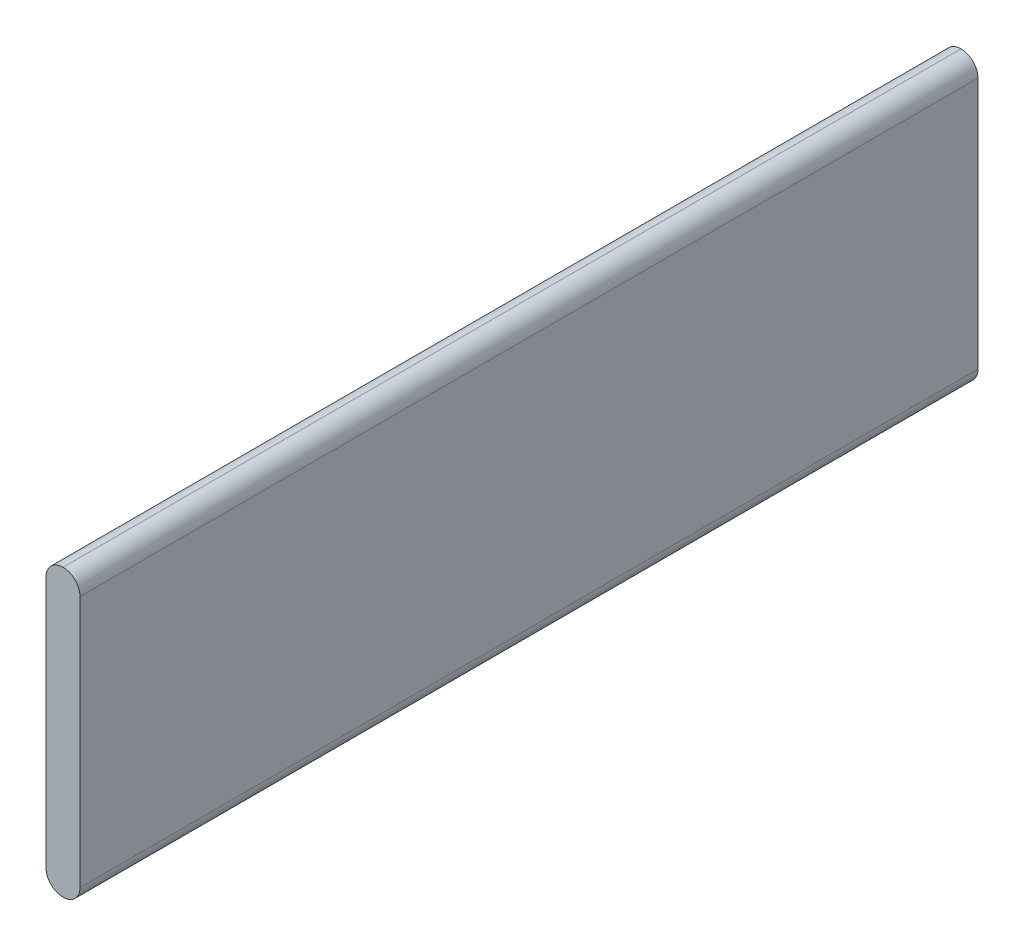
ISO-10303-21;
HEADER;
FILE_DESCRIPTION(('STEP AP214'),'2;1');
FILE_NAME('part.step','',(''),(''),'','','');
FILE_SCHEMA(('AUTOMOTIVE_DESIGN { 1 0 10303 214 1 1 1 1 }'));
ENDSEC;
DATA;
#1=APPLICATION_CONTEXT('core data for automotive mechanical design processes');
#2=APPLICATION_PROTOCOL_DEFINITION('international standard','automotive_design',2000,#1);
#3=PRODUCT_CONTEXT('',#1,'mechanical');
#4=PRODUCT('Part','Part','',(#3));
#5=PRODUCT_RELATED_PRODUCT_CATEGORY('part','',(#4));
#6=PRODUCT_DEFINITION_FORMATION('','',#4);
#7=PRODUCT_DEFINITION_CONTEXT('part definition',#1,'design');
#8=PRODUCT_DEFINITION('design','',#6,#7);
#9=PRODUCT_DEFINITION_SHAPE('','',#8);
#10=(LENGTH_UNIT() NAMED_UNIT(*) SI_UNIT(.MILLI.,.METRE.));
#11=(NAMED_UNIT(*) PLANE_ANGLE_UNIT() SI_UNIT($,.RADIAN.));
#12=(NAMED_UNIT(*) SI_UNIT($,.STERADIAN.) SOLID_ANGLE_UNIT());
#13=UNCERTAINTY_MEASURE_WITH_UNIT(LENGTH_MEASURE(1.E-05),#10,'distance_accuracy_value','');
#14=(GEOMETRIC_REPRESENTATION_CONTEXT(3) GLOBAL_UNCERTAINTY_ASSIGNED_CONTEXT((#13)) GLOBAL_UNIT_ASSIGNED_CONTEXT((#10,
#11,#12)) REPRESENTATION_CONTEXT('',''));
#15=CARTESIAN_POINT('',(0.,0.,0.));
#16=DIRECTION('',(0.,0.,1.));
#17=DIRECTION('',(1.,0.,0.));
#18=AXIS2_PLACEMENT_3D('',#15,#16,#17);
#19=CARTESIAN_POINT('',(-9.96167473590151,17.676969353008,65.9999999999999));
#20=DIRECTION('',(0.,0.,-1.));
#21=DIRECTION('',(-1.,0.,0.));
#22=AXIS2_PLACEMENT_3D('',#19,#20,#21);
#23=CYLINDRICAL_SURFACE('',#22,1.24);
#24=CARTESIAN_POINT('',(-9.96167473590151,17.6769693530079,0.));
#25=DIRECTION('',(0.,0.,1.));
#26=DIRECTION('',(-1.,0.,0.));
#27=AXIS2_PLACEMENT_3D('',#24,#25,#26);
#28=CIRCLE('',#27,1.24);
#29=CARTESIAN_POINT('',(-8.72167473590151,17.6769693530079,0.));
#30=VERTEX_POINT('',#29);
#31=CARTESIAN_POINT('',(-9.96167473590152,18.9169693530079,0.));
#32=VERTEX_POINT('',#31);
#33=EDGE_CURVE('E130',#30,#32,#28,.T.);
#34=ORIENTED_EDGE('',*,*,#33,.T.);
#35=DIRECTION('',(0.,0.,-1.));
#36=VECTOR('',#35,1.);
#37=CARTESIAN_POINT('',(-9.96167473590152,18.9169693530079,65.9999999999999));
#38=LINE('',#37,#36);
#39=CARTESIAN_POINT('',(-9.96167473590152,18.9169693530079,65.9999999999999));
#40=VERTEX_POINT('',#39);
#41=EDGE_CURVE('E11',#40,#32,#38,.T.);
#42=ORIENTED_EDGE('',*,*,#41,.F.);
#43=CARTESIAN_POINT('',(-9.96167473590151,17.676969353008,65.9999999999999));
#44=DIRECTION('',(0.,0.,1.));
#45=DIRECTION('',(-1.,0.,0.));
#46=AXIS2_PLACEMENT_3D('',#43,#44,#45);
#47=CIRCLE('',#46,1.24);
#48=CARTESIAN_POINT('',(-8.72167473590151,17.676969353008,66.));
#49=VERTEX_POINT('',#48);
#50=EDGE_CURVE('E144',#49,#40,#47,.T.);
#51=ORIENTED_EDGE('',*,*,#50,.F.);
#52=DIRECTION('',(0.,0.,-1.));
#53=VECTOR('',#52,1.);
#54=CARTESIAN_POINT('',(-8.72167473590151,17.676969353008,66.));
#55=LINE('',#54,#53);
#56=EDGE_CURVE('E126',#49,#30,#55,.T.);
#57=ORIENTED_EDGE('',*,*,#56,.T.);
#58=EDGE_LOOP('',(#34,#42,#51,#57));
#59=FACE_BOUND('',#58,.T.);
#60=ADVANCED_FACE('F34',(#59),#23,.T.);
#61=CARTESIAN_POINT('',(-9.9816747359015,18.9169693530079,65.9999999999999));
#62=DIRECTION('',(0.,-1.,0.));
#63=DIRECTION('',(0.,0.,-1.));
#64=AXIS2_PLACEMENT_3D('',#61,#62,#63);
#65=PLANE('',#64);
#66=DIRECTION('',(-1.,0.,0.));
#67=VECTOR('',#66,1.);
#68=CARTESIAN_POINT('',(-9.9816747359015,18.9169693530079,0.));
#69=LINE('',#68,#67);
#70=CARTESIAN_POINT('',(-9.9816747359015,18.9169693530079,0.));
#71=VERTEX_POINT('',#70);
#72=EDGE_CURVE('E133',#32,#71,#69,.T.);
#73=ORIENTED_EDGE('',*,*,#72,.T.);
#74=DIRECTION('',(0.,0.,-1.));
#75=VECTOR('',#74,1.);
#76=CARTESIAN_POINT('',(-9.9816747359015,18.9169693530079,65.9999999999999));
#77=LINE('',#76,#75);
#78=CARTESIAN_POINT('',(-9.9816747359015,18.9169693530079,65.9999999999999));
#79=VERTEX_POINT('',#78);
#80=EDGE_CURVE('E42',#79,#71,#77,.T.);
#81=ORIENTED_EDGE('',*,*,#80,.F.);
#82=DIRECTION('',(-1.,0.,0.));
#83=VECTOR('',#82,1.);
#84=CARTESIAN_POINT('',(-9.9816747359015,18.9169693530079,65.9999999999999));
#85=LINE('',#84,#83);
#86=EDGE_CURVE('E93',#40,#79,#85,.T.);
#87=ORIENTED_EDGE('',*,*,#86,.F.);
#88=ORIENTED_EDGE('',*,*,#41,.T.);
#89=EDGE_LOOP('',(#73,#81,#87,#88));
#90=FACE_BOUND('',#89,.T.);
#91=ADVANCED_FACE('F179',(#90),#65,.F.);
#92=CARTESIAN_POINT('',(-9.98167473590151,17.676969353008,65.9999999999999));
#93=DIRECTION('',(0.,0.,-1.));
#94=DIRECTION('',(-1.,0.,0.));
#95=AXIS2_PLACEMENT_3D('',#92,#93,#94);
#96=CYLINDRICAL_SURFACE('',#95,1.24);
#97=CARTESIAN_POINT('',(-9.98167473590151,17.6769693530079,0.));
#98=DIRECTION('',(0.,0.,1.));
#99=DIRECTION('',(-1.,0.,0.));
#100=AXIS2_PLACEMENT_3D('',#97,#98,#99);
#101=CIRCLE('',#100,1.24);
#102=CARTESIAN_POINT('',(-11.2216747359015,17.6769693530079,0.));
#103=VERTEX_POINT('',#102);
#104=EDGE_CURVE('E135',#71,#103,#101,.T.);
#105=ORIENTED_EDGE('',*,*,#104,.T.);
#106=DIRECTION('',(0.,0.,-1.));
#107=VECTOR('',#106,1.);
#108=CARTESIAN_POINT('',(-11.2216747359015,17.676969353008,66.));
#109=LINE('',#108,#107);
#110=CARTESIAN_POINT('',(-11.2216747359015,17.676969353008,66.));
#111=VERTEX_POINT('',#110);
#112=EDGE_CURVE('E151',#111,#103,#109,.T.);
#113=ORIENTED_EDGE('',*,*,#112,.F.);
#114=CARTESIAN_POINT('',(-9.98167473590151,17.676969353008,65.9999999999999));
#115=DIRECTION('',(0.,0.,1.));
#116=DIRECTION('',(-1.,0.,0.));
#117=AXIS2_PLACEMENT_3D('',#114,#115,#116);
#118=CIRCLE('',#117,1.24);
#119=EDGE_CURVE('E159',#79,#111,#118,.T.);
#120=ORIENTED_EDGE('',*,*,#119,.F.);
#121=ORIENTED_EDGE('',*,*,#80,.T.);
#122=EDGE_LOOP('',(#105,#113,#120,#121));
#123=FACE_BOUND('',#122,.T.);
#124=ADVANCED_FACE('F157',(#123),#96,.T.);
#125=CARTESIAN_POINT('',(-11.2216747359015,17.676969353008,66.));
#126=DIRECTION('',(1.,0.,0.));
#127=DIRECTION('',(0.,1.,0.));
#128=AXIS2_PLACEMENT_3D('',#125,#126,#127);
#129=PLANE('',#128);
#130=DIRECTION('',(0.,-1.,0.));
#131=VECTOR('',#130,1.);
#132=CARTESIAN_POINT('',(-11.2216747359015,17.6769693530079,0.));
#133=LINE('',#132,#131);
#134=CARTESIAN_POINT('',(-11.2216747359015,-0.843030646992045,0.));
#135=VERTEX_POINT('',#134);
#136=EDGE_CURVE('E137',#103,#135,#133,.T.);
#137=ORIENTED_EDGE('',*,*,#136,.T.);
#138=DIRECTION('',(0.,0.,-1.));
#139=VECTOR('',#138,1.);
#140=CARTESIAN_POINT('',(-11.2216747359015,-0.843030646992066,66.));
#141=LINE('',#140,#139);
#142=CARTESIAN_POINT('',(-11.2216747359015,-0.843030646992066,66.));
#143=VERTEX_POINT('',#142);
#144=EDGE_CURVE('E148',#143,#135,#141,.T.);
#145=ORIENTED_EDGE('',*,*,#144,.F.);
#146=DIRECTION('',(0.,-1.,0.));
#147=VECTOR('',#146,1.);
#148=CARTESIAN_POINT('',(-11.2216747359015,17.676969353008,66.));
#149=LINE('',#148,#147);
#150=EDGE_CURVE('E171',#111,#143,#149,.T.);
#151=ORIENTED_EDGE('',*,*,#150,.F.);
#152=ORIENTED_EDGE('',*,*,#112,.T.);
#153=EDGE_LOOP('',(#137,#145,#151,#152));
#154=FACE_BOUND('',#153,.T.);
#155=ADVANCED_FACE('F167',(#154),#129,.F.);
#156=CARTESIAN_POINT('',(-9.98167473590151,-0.843030646992073,66.));
#157=DIRECTION('',(0.,0.,-1.));
#158=DIRECTION('',(-1.,0.,0.));
#159=AXIS2_PLACEMENT_3D('',#156,#157,#158);
#160=CYLINDRICAL_SURFACE('',#159,1.24);
#161=CARTESIAN_POINT('',(-9.98167473590151,-0.843030646992059,0.));
#162=DIRECTION('',(0.,0.,1.));
#163=DIRECTION('',(1.,0.,0.));
#164=AXIS2_PLACEMENT_3D('',#161,#162,#163);
#165=CIRCLE('',#164,1.24);
#166=CARTESIAN_POINT('',(-9.9816747359015,-2.08303064699206,0.));
#167=VERTEX_POINT('',#166);
#168=EDGE_CURVE('E139',#135,#167,#165,.T.);
#169=ORIENTED_EDGE('',*,*,#168,.T.);
#170=DIRECTION('',(0.,0.,-1.));
#171=VECTOR('',#170,1.);
#172=CARTESIAN_POINT('',(-9.9816747359015,-2.08303064699208,66.));
#173=LINE('',#172,#171);
#174=CARTESIAN_POINT('',(-9.9816747359015,-2.08303064699208,66.));
#175=VERTEX_POINT('',#174);
#176=EDGE_CURVE('E121',#175,#167,#173,.T.);
#177=ORIENTED_EDGE('',*,*,#176,.F.);
#178=CARTESIAN_POINT('',(-9.98167473590151,-0.843030646992073,66.));
#179=DIRECTION('',(0.,0.,1.));
#180=DIRECTION('',(1.,0.,0.));
#181=AXIS2_PLACEMENT_3D('',#178,#179,#180);
#182=CIRCLE('',#181,1.24);
#183=EDGE_CURVE('E112',#143,#175,#182,.T.);
#184=ORIENTED_EDGE('',*,*,#183,.F.);
#185=ORIENTED_EDGE('',*,*,#144,.T.);
#186=EDGE_LOOP('',(#169,#177,#184,#185));
#187=FACE_BOUND('',#186,.T.);
#188=ADVANCED_FACE('F170',(#187),#160,.T.);
#189=CARTESIAN_POINT('',(-9.9816747359015,-2.08303064699208,66.));
#190=DIRECTION('',(0.,1.,0.));
#191=DIRECTION('',(0.,0.,1.));
#192=AXIS2_PLACEMENT_3D('',#189,#190,#191);
#193=PLANE('',#192);
#194=DIRECTION('',(1.,0.,0.));
#195=VECTOR('',#194,1.);
#196=CARTESIAN_POINT('',(-9.9816747359015,-2.08303064699206,0.));
#197=LINE('',#196,#195);
#198=CARTESIAN_POINT('',(-9.96167473590152,-2.08303064699206,0.));
#199=VERTEX_POINT('',#198);
#200=EDGE_CURVE('E120',#167,#199,#197,.T.);
#201=ORIENTED_EDGE('',*,*,#200,.T.);
#202=DIRECTION('',(0.,0.,-1.));
#203=VECTOR('',#202,1.);
#204=CARTESIAN_POINT('',(-9.96167473590152,-2.08303064699208,66.));
#205=LINE('',#204,#203);
#206=CARTESIAN_POINT('',(-9.96167473590152,-2.08303064699208,66.));
#207=VERTEX_POINT('',#206);
#208=EDGE_CURVE('E117',#207,#199,#205,.T.);
#209=ORIENTED_EDGE('',*,*,#208,.F.);
#210=DIRECTION('',(1.,0.,0.));
#211=VECTOR('',#210,1.);
#212=CARTESIAN_POINT('',(-9.9816747359015,-2.08303064699208,66.));
#213=LINE('',#212,#211);
#214=EDGE_CURVE('E106',#175,#207,#213,.T.);
#215=ORIENTED_EDGE('',*,*,#214,.F.);
#216=ORIENTED_EDGE('',*,*,#176,.T.);
#217=EDGE_LOOP('',(#201,#209,#215,#216));
#218=FACE_BOUND('',#217,.T.);
#219=ADVANCED_FACE('F118',(#218),#193,.F.);
#220=CARTESIAN_POINT('',(-9.96167473590151,-0.843030646992073,66.));
#221=DIRECTION('',(0.,0.,-1.));
#222=DIRECTION('',(-1.,0.,0.));
#223=AXIS2_PLACEMENT_3D('',#220,#221,#222);
#224=CYLINDRICAL_SURFACE('',#223,1.24);
#225=CARTESIAN_POINT('',(-9.96167473590151,-0.843030646992059,0.));
#226=DIRECTION('',(0.,0.,1.));
#227=DIRECTION('',(-1.,0.,0.));
#228=AXIS2_PLACEMENT_3D('',#225,#226,#227);
#229=CIRCLE('',#228,1.24);
#230=CARTESIAN_POINT('',(-8.7216747359015,-0.843030646992045,0.));
#231=VERTEX_POINT('',#230);
#232=EDGE_CURVE('E79',#199,#231,#229,.T.);
#233=ORIENTED_EDGE('',*,*,#232,.T.);
#234=DIRECTION('',(0.,0.,-1.));
#235=VECTOR('',#234,1.);
#236=CARTESIAN_POINT('',(-8.72167473590151,-0.843030646992066,65.9999999999999));
#237=LINE('',#236,#235);
#238=CARTESIAN_POINT('',(-8.72167473590151,-0.843030646992066,65.9999999999999));
#239=VERTEX_POINT('',#238);
#240=EDGE_CURVE('E122',#239,#231,#237,.T.);
#241=ORIENTED_EDGE('',*,*,#240,.F.);
#242=CARTESIAN_POINT('',(-9.96167473590151,-0.843030646992073,66.));
#243=DIRECTION('',(0.,0.,1.));
#244=DIRECTION('',(-1.,0.,0.));
#245=AXIS2_PLACEMENT_3D('',#242,#243,#244);
#246=CIRCLE('',#245,1.24);
#247=EDGE_CURVE('E110',#207,#239,#246,.T.);
#248=ORIENTED_EDGE('',*,*,#247,.F.);
#249=ORIENTED_EDGE('',*,*,#208,.T.);
#250=EDGE_LOOP('',(#233,#241,#248,#249));
#251=FACE_BOUND('',#250,.T.);
#252=ADVANCED_FACE('F124',(#251),#224,.T.);
#253=CARTESIAN_POINT('',(-8.72167473590151,17.676969353008,66.));
#254=DIRECTION('',(-1.,0.,0.));
#255=DIRECTION('',(0.,0.,1.));
#256=AXIS2_PLACEMENT_3D('',#253,#254,#255);
#257=PLANE('',#256);
#258=DIRECTION('',(0.,1.,0.));
#259=VECTOR('',#258,1.);
#260=CARTESIAN_POINT('',(-8.72167473590151,17.6769693530079,0.));
#261=LINE('',#260,#259);
#262=EDGE_CURVE('E85',#231,#30,#261,.T.);
#263=ORIENTED_EDGE('',*,*,#262,.T.);
#264=ORIENTED_EDGE('',*,*,#56,.F.);
#265=DIRECTION('',(0.,1.,0.));
#266=VECTOR('',#265,1.);
#267=CARTESIAN_POINT('',(-8.72167473590151,17.676969353008,66.));
#268=LINE('',#267,#266);
#269=EDGE_CURVE('E50',#239,#49,#268,.T.);
#270=ORIENTED_EDGE('',*,*,#269,.F.);
#271=ORIENTED_EDGE('',*,*,#240,.T.);
#272=EDGE_LOOP('',(#263,#264,#270,#271));
#273=FACE_BOUND('',#272,.T.);
#274=ADVANCED_FACE('F195',(#273),#257,.F.);
#275=CARTESIAN_POINT('',(-9.96167473590151,17.676969353008,65.9999999999999));
#276=DIRECTION('',(0.,0.,-1.));
#277=DIRECTION('',(-1.,0.,0.));
#278=AXIS2_PLACEMENT_3D('',#275,#276,#277);
#279=PLANE('',#278);
#280=ORIENTED_EDGE('',*,*,#50,.T.);
#281=ORIENTED_EDGE('',*,*,#86,.T.);
#282=ORIENTED_EDGE('',*,*,#119,.T.);
#283=ORIENTED_EDGE('',*,*,#150,.T.);
#284=ORIENTED_EDGE('',*,*,#183,.T.);
#285=ORIENTED_EDGE('',*,*,#214,.T.);
#286=ORIENTED_EDGE('',*,*,#247,.T.);
#287=ORIENTED_EDGE('',*,*,#269,.T.);
#288=EDGE_LOOP('',(#280,#281,#282,#283,#284,#285,#286,#287));
#289=FACE_BOUND('',#288,.T.);
#290=ADVANCED_FACE('F108',(#289),#279,.F.);
#291=CARTESIAN_POINT('',(-9.96167473590151,17.6769693530079,0.));
#292=DIRECTION('',(0.,0.,-1.));
#293=DIRECTION('',(-1.,0.,0.));
#294=AXIS2_PLACEMENT_3D('',#291,#292,#293);
#295=PLANE('',#294);
#296=ORIENTED_EDGE('',*,*,#33,.F.);
#297=ORIENTED_EDGE('',*,*,#262,.F.);
#298=ORIENTED_EDGE('',*,*,#232,.F.);
#299=ORIENTED_EDGE('',*,*,#200,.F.);
#300=ORIENTED_EDGE('',*,*,#168,.F.);
#301=ORIENTED_EDGE('',*,*,#136,.F.);
#302=ORIENTED_EDGE('',*,*,#104,.F.);
#303=ORIENTED_EDGE('',*,*,#72,.F.);
#304=EDGE_LOOP('',(#296,#297,#298,#299,#300,#301,#302,#303));
#305=FACE_BOUND('',#304,.T.);
#306=ADVANCED_FACE('F163',(#305),#295,.T.);
#307=CLOSED_SHELL('',(#60,#91,#124,#155,#188,#219,#252,#274,#290,#306));
#308=MANIFOLD_SOLID_BREP('B2',#307);
#309=ADVANCED_BREP_SHAPE_REPRESENTATION('',(#18,#308),#14);
#310=SHAPE_DEFINITION_REPRESENTATION(#9,#309);
ENDSEC;
END-ISO-10303-21;
